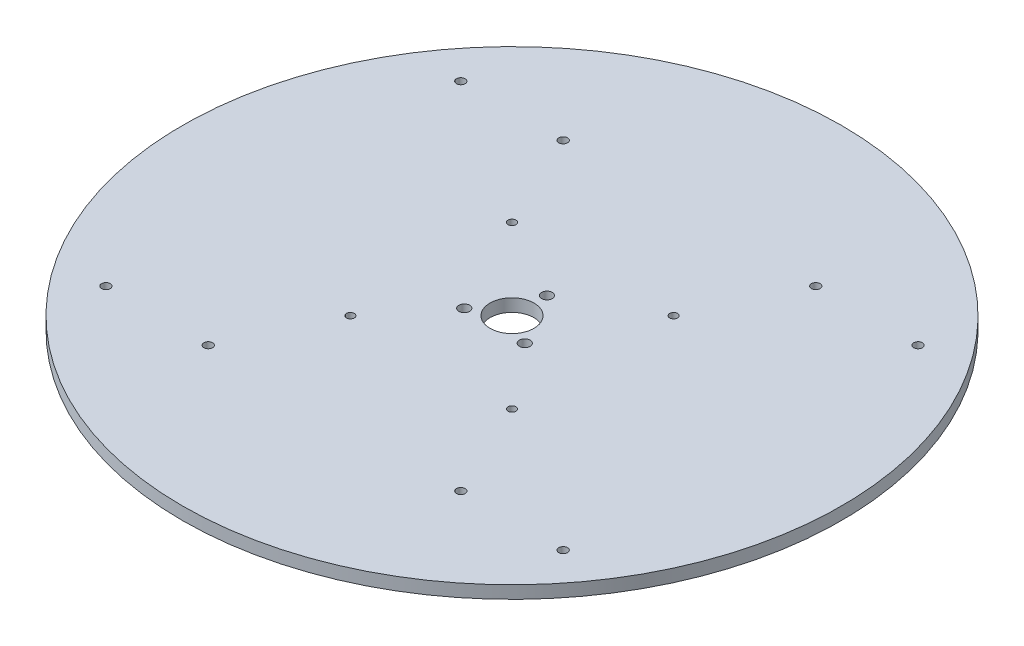
ISO-10303-21;
HEADER;
FILE_DESCRIPTION(('STEP AP214'),'2;1');
FILE_NAME('part.step','',(''),(''),'','','');
FILE_SCHEMA(('AUTOMOTIVE_DESIGN { 1 0 10303 214 1 1 1 1 }'));
ENDSEC;
DATA;
#1=APPLICATION_CONTEXT('core data for automotive mechanical design processes');
#2=APPLICATION_PROTOCOL_DEFINITION('international standard','automotive_design',2000,#1);
#3=PRODUCT_CONTEXT('',#1,'mechanical');
#4=PRODUCT('Part','Part','',(#3));
#5=PRODUCT_RELATED_PRODUCT_CATEGORY('part','',(#4));
#6=PRODUCT_DEFINITION_FORMATION('','',#4);
#7=PRODUCT_DEFINITION_CONTEXT('part definition',#1,'design');
#8=PRODUCT_DEFINITION('design','',#6,#7);
#9=PRODUCT_DEFINITION_SHAPE('','',#8);
#10=(LENGTH_UNIT() NAMED_UNIT(*) SI_UNIT(.MILLI.,.METRE.));
#11=(NAMED_UNIT(*) PLANE_ANGLE_UNIT() SI_UNIT($,.RADIAN.));
#12=(NAMED_UNIT(*) SI_UNIT($,.STERADIAN.) SOLID_ANGLE_UNIT());
#13=UNCERTAINTY_MEASURE_WITH_UNIT(LENGTH_MEASURE(1.E-05),#10,'distance_accuracy_value','');
#14=(GEOMETRIC_REPRESENTATION_CONTEXT(3) GLOBAL_UNCERTAINTY_ASSIGNED_CONTEXT((#13)) GLOBAL_UNIT_ASSIGNED_CONTEXT((#10,
#11,#12)) REPRESENTATION_CONTEXT('',''));
#15=CARTESIAN_POINT('',(0.,0.,0.));
#16=DIRECTION('',(0.,0.,1.));
#17=DIRECTION('',(1.,0.,0.));
#18=AXIS2_PLACEMENT_3D('',#15,#16,#17);
#19=CARTESIAN_POINT('',(0.,6.35,0.));
#20=DIRECTION('',(0.,-1.,0.));
#21=DIRECTION('',(0.,0.,-1.));
#22=AXIS2_PLACEMENT_3D('',#19,#20,#21);
#23=CYLINDRICAL_SURFACE('',#22,165.1);
#24=CARTESIAN_POINT('',(0.,6.35,0.));
#25=DIRECTION('',(0.,1.,0.));
#26=DIRECTION('',(0.,0.,1.));
#27=AXIS2_PLACEMENT_3D('',#24,#25,#26);
#28=CIRCLE('',#27,165.1);
#29=CARTESIAN_POINT('',(0.,6.35,165.1));
#30=VERTEX_POINT('',#29);
#31=EDGE_CURVE('E10',#30,#30,#28,.T.);
#32=ORIENTED_EDGE('',*,*,#31,.F.);
#33=EDGE_LOOP('',(#32));
#34=FACE_BOUND('',#33,.T.);
#35=CARTESIAN_POINT('',(0.,0.,0.));
#36=DIRECTION('',(0.,1.,0.));
#37=DIRECTION('',(0.,0.,1.));
#38=AXIS2_PLACEMENT_3D('',#35,#36,#37);
#39=CIRCLE('',#38,165.1);
#40=CARTESIAN_POINT('',(0.,0.,165.1));
#41=VERTEX_POINT('',#40);
#42=EDGE_CURVE('E34',#41,#41,#39,.T.);
#43=ORIENTED_EDGE('',*,*,#42,.T.);
#44=EDGE_LOOP('',(#43));
#45=FACE_BOUND('',#44,.T.);
#46=ADVANCED_FACE('F31',(#34,#45),#23,.T.);
#47=CARTESIAN_POINT('',(0.,6.35,0.));
#48=DIRECTION('',(0.,1.,0.));
#49=DIRECTION('',(0.,0.,1.));
#50=AXIS2_PLACEMENT_3D('',#47,#48,#49);
#51=PLANE('',#50);
#52=CARTESIAN_POINT('',(-63.2587,6.35,-88.9));
#53=DIRECTION('',(0.,1.,0.));
#54=DIRECTION('',(0.,0.,1.));
#55=AXIS2_PLACEMENT_3D('',#52,#53,#54);
#56=CIRCLE('',#55,2.1828125);
#57=CARTESIAN_POINT('',(-63.2587,6.35,-86.7171875));
#58=VERTEX_POINT('',#57);
#59=EDGE_CURVE('E133',#58,#58,#56,.T.);
#60=ORIENTED_EDGE('',*,*,#59,.F.);
#61=EDGE_LOOP('',(#60));
#62=FACE_BOUND('',#61,.T.);
#63=CARTESIAN_POINT('',(63.2587,6.35,-88.9));
#64=DIRECTION('',(0.,1.,0.));
#65=DIRECTION('',(0.,0.,1.));
#66=AXIS2_PLACEMENT_3D('',#63,#64,#65);
#67=CIRCLE('',#66,2.1828125);
#68=CARTESIAN_POINT('',(63.2587,6.35,-86.7171875));
#69=VERTEX_POINT('',#68);
#70=EDGE_CURVE('E127',#69,#69,#67,.T.);
#71=ORIENTED_EDGE('',*,*,#70,.F.);
#72=EDGE_LOOP('',(#71));
#73=FACE_BOUND('',#72,.T.);
#74=CARTESIAN_POINT('',(114.5413,6.35,-88.9));
#75=DIRECTION('',(0.,1.,0.));
#76=DIRECTION('',(0.,0.,1.));
#77=AXIS2_PLACEMENT_3D('',#74,#75,#76);
#78=CIRCLE('',#77,2.18281250000001);
#79=CARTESIAN_POINT('',(114.5413,6.35,-86.7171875));
#80=VERTEX_POINT('',#79);
#81=EDGE_CURVE('E121',#80,#80,#78,.T.);
#82=ORIENTED_EDGE('',*,*,#81,.F.);
#83=EDGE_LOOP('',(#82));
#84=FACE_BOUND('',#83,.T.);
#85=CARTESIAN_POINT('',(114.5413,6.35,88.8999999999999));
#86=DIRECTION('',(0.,1.,0.));
#87=DIRECTION('',(0.,0.,1.));
#88=AXIS2_PLACEMENT_3D('',#85,#86,#87);
#89=CIRCLE('',#88,2.18281250000001);
#90=CARTESIAN_POINT('',(114.5413,6.35,91.0828125));
#91=VERTEX_POINT('',#90);
#92=EDGE_CURVE('E115',#91,#91,#89,.T.);
#93=ORIENTED_EDGE('',*,*,#92,.F.);
#94=EDGE_LOOP('',(#93));
#95=FACE_BOUND('',#94,.T.);
#96=CARTESIAN_POINT('',(63.2587,6.35,88.9));
#97=DIRECTION('',(0.,1.,0.));
#98=DIRECTION('',(0.,0.,1.));
#99=AXIS2_PLACEMENT_3D('',#96,#97,#98);
#100=CIRCLE('',#99,2.1828125);
#101=CARTESIAN_POINT('',(63.2587,6.35,91.0828125));
#102=VERTEX_POINT('',#101);
#103=EDGE_CURVE('E109',#102,#102,#100,.T.);
#104=ORIENTED_EDGE('',*,*,#103,.F.);
#105=EDGE_LOOP('',(#104));
#106=FACE_BOUND('',#105,.T.);
#107=CARTESIAN_POINT('',(-63.2587,6.35,88.8999999999999));
#108=DIRECTION('',(0.,1.,0.));
#109=DIRECTION('',(0.,0.,1.));
#110=AXIS2_PLACEMENT_3D('',#107,#108,#109);
#111=CIRCLE('',#110,2.1828125);
#112=CARTESIAN_POINT('',(-63.2587,6.35,91.0828125));
#113=VERTEX_POINT('',#112);
#114=EDGE_CURVE('E103',#113,#113,#111,.T.);
#115=ORIENTED_EDGE('',*,*,#114,.F.);
#116=EDGE_LOOP('',(#115));
#117=FACE_BOUND('',#116,.T.);
#118=CARTESIAN_POINT('',(-114.5413,6.35,88.9));
#119=DIRECTION('',(0.,1.,0.));
#120=DIRECTION('',(0.,0.,1.));
#121=AXIS2_PLACEMENT_3D('',#118,#119,#120);
#122=CIRCLE('',#121,2.1828125);
#123=CARTESIAN_POINT('',(-114.5413,6.35,91.0828125));
#124=VERTEX_POINT('',#123);
#125=EDGE_CURVE('E97',#124,#124,#122,.T.);
#126=ORIENTED_EDGE('',*,*,#125,.F.);
#127=EDGE_LOOP('',(#126));
#128=FACE_BOUND('',#127,.T.);
#129=CARTESIAN_POINT('',(-114.5413,6.35,-88.9));
#130=DIRECTION('',(0.,1.,0.));
#131=DIRECTION('',(0.,0.,1.));
#132=AXIS2_PLACEMENT_3D('',#129,#130,#131);
#133=CIRCLE('',#132,2.1828125);
#134=CARTESIAN_POINT('',(-114.5413,6.35,-86.7171875));
#135=VERTEX_POINT('',#134);
#136=EDGE_CURVE('E91',#135,#135,#133,.T.);
#137=ORIENTED_EDGE('',*,*,#136,.F.);
#138=EDGE_LOOP('',(#137));
#139=FACE_BOUND('',#138,.T.);
#140=CARTESIAN_POINT('',(15.1554445662276,6.35,8.75000000000007));
#141=DIRECTION('',(0.,1.,0.));
#142=DIRECTION('',(0.,0.,1.));
#143=AXIS2_PLACEMENT_3D('',#140,#141,#142);
#144=CIRCLE('',#143,2.7);
#145=CARTESIAN_POINT('',(15.1554445662276,6.35,11.4500000000001));
#146=VERTEX_POINT('',#145);
#147=EDGE_CURVE('E67',#146,#146,#144,.T.);
#148=ORIENTED_EDGE('',*,*,#147,.F.);
#149=EDGE_LOOP('',(#148));
#150=FACE_BOUND('',#149,.T.);
#151=CARTESIAN_POINT('',(-15.1554445662276,6.35,8.75000000000007));
#152=DIRECTION('',(0.,1.,0.));
#153=DIRECTION('',(0.,0.,1.));
#154=AXIS2_PLACEMENT_3D('',#151,#152,#153);
#155=CIRCLE('',#154,2.7);
#156=CARTESIAN_POINT('',(-15.1554445662276,6.35,11.4500000000001));
#157=VERTEX_POINT('',#156);
#158=EDGE_CURVE('E74',#157,#157,#155,.T.);
#159=ORIENTED_EDGE('',*,*,#158,.F.);
#160=EDGE_LOOP('',(#159));
#161=FACE_BOUND('',#160,.T.);
#162=CARTESIAN_POINT('',(0.,6.35,-17.5));
#163=DIRECTION('',(0.,1.,0.));
#164=DIRECTION('',(0.,0.,1.));
#165=AXIS2_PLACEMENT_3D('',#162,#163,#164);
#166=CIRCLE('',#165,2.7);
#167=CARTESIAN_POINT('',(0.,6.35,-14.8));
#168=VERTEX_POINT('',#167);
#169=EDGE_CURVE('E80',#168,#168,#166,.T.);
#170=ORIENTED_EDGE('',*,*,#169,.F.);
#171=EDGE_LOOP('',(#170));
#172=FACE_BOUND('',#171,.T.);
#173=CARTESIAN_POINT('',(40.4876,6.35,-40.4876));
#174=DIRECTION('',(0.,1.,0.));
#175=DIRECTION('',(0.,0.,1.));
#176=AXIS2_PLACEMENT_3D('',#173,#174,#175);
#177=CIRCLE('',#176,1.98437499999999);
#178=CARTESIAN_POINT('',(40.4876,6.35,-38.503225));
#179=VERTEX_POINT('',#178);
#180=EDGE_CURVE('E86',#179,#179,#177,.T.);
#181=ORIENTED_EDGE('',*,*,#180,.F.);
#182=EDGE_LOOP('',(#181));
#183=FACE_BOUND('',#182,.T.);
#184=CARTESIAN_POINT('',(40.4876,6.35,40.4876));
#185=DIRECTION('',(0.,1.,0.));
#186=DIRECTION('',(0.,0.,1.));
#187=AXIS2_PLACEMENT_3D('',#184,#185,#186);
#188=CIRCLE('',#187,1.98437499999999);
#189=CARTESIAN_POINT('',(40.4876,6.35,42.471975));
#190=VERTEX_POINT('',#189);
#191=EDGE_CURVE('E49',#190,#190,#188,.T.);
#192=ORIENTED_EDGE('',*,*,#191,.F.);
#193=EDGE_LOOP('',(#192));
#194=FACE_BOUND('',#193,.T.);
#195=CARTESIAN_POINT('',(-40.4876,6.35,40.4876));
#196=DIRECTION('',(0.,1.,0.));
#197=DIRECTION('',(0.,0.,1.));
#198=AXIS2_PLACEMENT_3D('',#195,#196,#197);
#199=CIRCLE('',#198,1.98437499999999);
#200=CARTESIAN_POINT('',(-40.4876,6.35,42.471975));
#201=VERTEX_POINT('',#200);
#202=EDGE_CURVE('E56',#201,#201,#199,.T.);
#203=ORIENTED_EDGE('',*,*,#202,.F.);
#204=EDGE_LOOP('',(#203));
#205=FACE_BOUND('',#204,.T.);
#206=CARTESIAN_POINT('',(-40.4876,6.35,-40.4876));
#207=DIRECTION('',(0.,1.,0.));
#208=DIRECTION('',(0.,0.,1.));
#209=AXIS2_PLACEMENT_3D('',#206,#207,#208);
#210=CIRCLE('',#209,1.98437499999999);
#211=CARTESIAN_POINT('',(-40.4876,6.35,-38.503225));
#212=VERTEX_POINT('',#211);
#213=EDGE_CURVE('E62',#212,#212,#210,.T.);
#214=ORIENTED_EDGE('',*,*,#213,.F.);
#215=EDGE_LOOP('',(#214));
#216=FACE_BOUND('',#215,.T.);
#217=CARTESIAN_POINT('',(0.,6.35,0.));
#218=DIRECTION('',(0.,1.,0.));
#219=DIRECTION('',(0.,0.,1.));
#220=AXIS2_PLACEMENT_3D('',#217,#218,#219);
#221=CIRCLE('',#220,11.);
#222=CARTESIAN_POINT('',(0.,6.35,11.));
#223=VERTEX_POINT('',#222);
#224=EDGE_CURVE('E43',#223,#223,#221,.T.);
#225=ORIENTED_EDGE('',*,*,#224,.F.);
#226=EDGE_LOOP('',(#225));
#227=FACE_BOUND('',#226,.T.);
#228=ORIENTED_EDGE('',*,*,#31,.T.);
#229=EDGE_LOOP('',(#228));
#230=FACE_BOUND('',#229,.T.);
#231=ADVANCED_FACE('F149',(#62,#73,#84,#95,#106,#117,#128,#139,#150,#161,#172,#183,#194,#205,
#216,#227,#230),#51,.T.);
#232=CARTESIAN_POINT('',(0.,0.,0.));
#233=DIRECTION('',(0.,1.,0.));
#234=DIRECTION('',(0.,0.,1.));
#235=AXIS2_PLACEMENT_3D('',#232,#233,#234);
#236=PLANE('',#235);
#237=CARTESIAN_POINT('',(-63.2587,0.,-88.9));
#238=DIRECTION('',(0.,1.,0.));
#239=DIRECTION('',(0.,0.,1.));
#240=AXIS2_PLACEMENT_3D('',#237,#238,#239);
#241=CIRCLE('',#240,2.1828125);
#242=CARTESIAN_POINT('',(-63.2587,0.,-86.7171875));
#243=VERTEX_POINT('',#242);
#244=EDGE_CURVE('E94',#243,#243,#241,.T.);
#245=ORIENTED_EDGE('',*,*,#244,.T.);
#246=EDGE_LOOP('',(#245));
#247=FACE_BOUND('',#246,.T.);
#248=CARTESIAN_POINT('',(63.2587,0.,-88.9));
#249=DIRECTION('',(0.,1.,0.));
#250=DIRECTION('',(0.,0.,1.));
#251=AXIS2_PLACEMENT_3D('',#248,#249,#250);
#252=CIRCLE('',#251,2.1828125);
#253=CARTESIAN_POINT('',(63.2587,0.,-86.7171875));
#254=VERTEX_POINT('',#253);
#255=EDGE_CURVE('E130',#254,#254,#252,.T.);
#256=ORIENTED_EDGE('',*,*,#255,.T.);
#257=EDGE_LOOP('',(#256));
#258=FACE_BOUND('',#257,.T.);
#259=CARTESIAN_POINT('',(114.5413,0.,-88.9));
#260=DIRECTION('',(0.,1.,0.));
#261=DIRECTION('',(0.,0.,1.));
#262=AXIS2_PLACEMENT_3D('',#259,#260,#261);
#263=CIRCLE('',#262,2.18281250000001);
#264=CARTESIAN_POINT('',(114.5413,0.,-86.7171875));
#265=VERTEX_POINT('',#264);
#266=EDGE_CURVE('E124',#265,#265,#263,.T.);
#267=ORIENTED_EDGE('',*,*,#266,.T.);
#268=EDGE_LOOP('',(#267));
#269=FACE_BOUND('',#268,.T.);
#270=CARTESIAN_POINT('',(114.5413,0.,88.8999999999999));
#271=DIRECTION('',(0.,1.,0.));
#272=DIRECTION('',(0.,0.,1.));
#273=AXIS2_PLACEMENT_3D('',#270,#271,#272);
#274=CIRCLE('',#273,2.18281250000001);
#275=CARTESIAN_POINT('',(114.5413,0.,91.0828125));
#276=VERTEX_POINT('',#275);
#277=EDGE_CURVE('E118',#276,#276,#274,.T.);
#278=ORIENTED_EDGE('',*,*,#277,.T.);
#279=EDGE_LOOP('',(#278));
#280=FACE_BOUND('',#279,.T.);
#281=CARTESIAN_POINT('',(63.2587,0.,88.9));
#282=DIRECTION('',(0.,1.,0.));
#283=DIRECTION('',(0.,0.,1.));
#284=AXIS2_PLACEMENT_3D('',#281,#282,#283);
#285=CIRCLE('',#284,2.1828125);
#286=CARTESIAN_POINT('',(63.2587,0.,91.0828125));
#287=VERTEX_POINT('',#286);
#288=EDGE_CURVE('E112',#287,#287,#285,.T.);
#289=ORIENTED_EDGE('',*,*,#288,.T.);
#290=EDGE_LOOP('',(#289));
#291=FACE_BOUND('',#290,.T.);
#292=CARTESIAN_POINT('',(-63.2587,0.,88.8999999999999));
#293=DIRECTION('',(0.,1.,0.));
#294=DIRECTION('',(0.,0.,1.));
#295=AXIS2_PLACEMENT_3D('',#292,#293,#294);
#296=CIRCLE('',#295,2.1828125);
#297=CARTESIAN_POINT('',(-63.2587,0.,91.0828125));
#298=VERTEX_POINT('',#297);
#299=EDGE_CURVE('E106',#298,#298,#296,.T.);
#300=ORIENTED_EDGE('',*,*,#299,.T.);
#301=EDGE_LOOP('',(#300));
#302=FACE_BOUND('',#301,.T.);
#303=CARTESIAN_POINT('',(-114.5413,0.,88.9));
#304=DIRECTION('',(0.,1.,0.));
#305=DIRECTION('',(0.,0.,1.));
#306=AXIS2_PLACEMENT_3D('',#303,#304,#305);
#307=CIRCLE('',#306,2.1828125);
#308=CARTESIAN_POINT('',(-114.5413,0.,91.0828125));
#309=VERTEX_POINT('',#308);
#310=EDGE_CURVE('E100',#309,#309,#307,.T.);
#311=ORIENTED_EDGE('',*,*,#310,.T.);
#312=EDGE_LOOP('',(#311));
#313=FACE_BOUND('',#312,.T.);
#314=CARTESIAN_POINT('',(-114.5413,0.,-88.9));
#315=DIRECTION('',(0.,1.,0.));
#316=DIRECTION('',(0.,0.,1.));
#317=AXIS2_PLACEMENT_3D('',#314,#315,#316);
#318=CIRCLE('',#317,2.1828125);
#319=CARTESIAN_POINT('',(-114.5413,0.,-86.7171875));
#320=VERTEX_POINT('',#319);
#321=EDGE_CURVE('E71',#320,#320,#318,.T.);
#322=ORIENTED_EDGE('',*,*,#321,.T.);
#323=EDGE_LOOP('',(#322));
#324=FACE_BOUND('',#323,.T.);
#325=CARTESIAN_POINT('',(15.1554445662276,0.,8.75000000000007));
#326=DIRECTION('',(0.,1.,0.));
#327=DIRECTION('',(0.,0.,1.));
#328=AXIS2_PLACEMENT_3D('',#325,#326,#327);
#329=CIRCLE('',#328,2.7);
#330=CARTESIAN_POINT('',(15.1554445662276,0.,11.4500000000001));
#331=VERTEX_POINT('',#330);
#332=EDGE_CURVE('E70',#331,#331,#329,.T.);
#333=ORIENTED_EDGE('',*,*,#332,.T.);
#334=EDGE_LOOP('',(#333));
#335=FACE_BOUND('',#334,.T.);
#336=CARTESIAN_POINT('',(-15.1554445662276,0.,8.75000000000007));
#337=DIRECTION('',(0.,1.,0.));
#338=DIRECTION('',(0.,0.,1.));
#339=AXIS2_PLACEMENT_3D('',#336,#337,#338);
#340=CIRCLE('',#339,2.7);
#341=CARTESIAN_POINT('',(-15.1554445662276,0.,11.4500000000001));
#342=VERTEX_POINT('',#341);
#343=EDGE_CURVE('E77',#342,#342,#340,.T.);
#344=ORIENTED_EDGE('',*,*,#343,.T.);
#345=EDGE_LOOP('',(#344));
#346=FACE_BOUND('',#345,.T.);
#347=CARTESIAN_POINT('',(0.,0.,-17.5));
#348=DIRECTION('',(0.,1.,0.));
#349=DIRECTION('',(0.,0.,1.));
#350=AXIS2_PLACEMENT_3D('',#347,#348,#349);
#351=CIRCLE('',#350,2.7);
#352=CARTESIAN_POINT('',(0.,0.,-14.8));
#353=VERTEX_POINT('',#352);
#354=EDGE_CURVE('E83',#353,#353,#351,.T.);
#355=ORIENTED_EDGE('',*,*,#354,.T.);
#356=EDGE_LOOP('',(#355));
#357=FACE_BOUND('',#356,.T.);
#358=CARTESIAN_POINT('',(40.4876,0.,-40.4876));
#359=DIRECTION('',(0.,1.,0.));
#360=DIRECTION('',(0.,0.,1.));
#361=AXIS2_PLACEMENT_3D('',#358,#359,#360);
#362=CIRCLE('',#361,1.98437499999999);
#363=CARTESIAN_POINT('',(40.4876,0.,-38.503225));
#364=VERTEX_POINT('',#363);
#365=EDGE_CURVE('E53',#364,#364,#362,.T.);
#366=ORIENTED_EDGE('',*,*,#365,.T.);
#367=EDGE_LOOP('',(#366));
#368=FACE_BOUND('',#367,.T.);
#369=CARTESIAN_POINT('',(40.4876,0.,40.4876));
#370=DIRECTION('',(0.,1.,0.));
#371=DIRECTION('',(0.,0.,1.));
#372=AXIS2_PLACEMENT_3D('',#369,#370,#371);
#373=CIRCLE('',#372,1.98437499999999);
#374=CARTESIAN_POINT('',(40.4876,0.,42.471975));
#375=VERTEX_POINT('',#374);
#376=EDGE_CURVE('E52',#375,#375,#373,.T.);
#377=ORIENTED_EDGE('',*,*,#376,.T.);
#378=EDGE_LOOP('',(#377));
#379=FACE_BOUND('',#378,.T.);
#380=CARTESIAN_POINT('',(-40.4876,0.,40.4876));
#381=DIRECTION('',(0.,1.,0.));
#382=DIRECTION('',(0.,0.,1.));
#383=AXIS2_PLACEMENT_3D('',#380,#381,#382);
#384=CIRCLE('',#383,1.98437499999999);
#385=CARTESIAN_POINT('',(-40.4876,0.,42.471975));
#386=VERTEX_POINT('',#385);
#387=EDGE_CURVE('E59',#386,#386,#384,.T.);
#388=ORIENTED_EDGE('',*,*,#387,.T.);
#389=EDGE_LOOP('',(#388));
#390=FACE_BOUND('',#389,.T.);
#391=CARTESIAN_POINT('',(-40.4876,0.,-40.4876));
#392=DIRECTION('',(0.,1.,0.));
#393=DIRECTION('',(0.,0.,1.));
#394=AXIS2_PLACEMENT_3D('',#391,#392,#393);
#395=CIRCLE('',#394,1.98437499999999);
#396=CARTESIAN_POINT('',(-40.4876,0.,-38.503225));
#397=VERTEX_POINT('',#396);
#398=EDGE_CURVE('E46',#397,#397,#395,.T.);
#399=ORIENTED_EDGE('',*,*,#398,.T.);
#400=EDGE_LOOP('',(#399));
#401=FACE_BOUND('',#400,.T.);
#402=CARTESIAN_POINT('',(0.,0.,0.));
#403=DIRECTION('',(0.,1.,0.));
#404=DIRECTION('',(0.,0.,1.));
#405=AXIS2_PLACEMENT_3D('',#402,#403,#404);
#406=CIRCLE('',#405,11.);
#407=CARTESIAN_POINT('',(0.,0.,11.));
#408=VERTEX_POINT('',#407);
#409=EDGE_CURVE('E41',#408,#408,#406,.T.);
#410=ORIENTED_EDGE('',*,*,#409,.T.);
#411=EDGE_LOOP('',(#410));
#412=FACE_BOUND('',#411,.T.);
#413=ORIENTED_EDGE('',*,*,#42,.F.);
#414=EDGE_LOOP('',(#413));
#415=FACE_BOUND('',#414,.T.);
#416=ADVANCED_FACE('F139',(#247,#258,#269,#280,#291,#302,#313,#324,#335,#346,#357,#368,#379,
#390,#401,#412,#415),#236,.F.);
#417=CARTESIAN_POINT('',(0.,0.,0.));
#418=DIRECTION('',(0.,1.,0.));
#419=DIRECTION('',(0.,0.,1.));
#420=AXIS2_PLACEMENT_3D('',#417,#418,#419);
#421=CYLINDRICAL_SURFACE('',#420,11.);
#422=ORIENTED_EDGE('',*,*,#409,.F.);
#423=EDGE_LOOP('',(#422));
#424=FACE_BOUND('',#423,.T.);
#425=ORIENTED_EDGE('',*,*,#224,.T.);
#426=EDGE_LOOP('',(#425));
#427=FACE_BOUND('',#426,.T.);
#428=ADVANCED_FACE('F183',(#424,#427),#421,.F.);
#429=CARTESIAN_POINT('',(-40.4876,0.,-40.4876));
#430=DIRECTION('',(0.,1.,0.));
#431=DIRECTION('',(0.,0.,1.));
#432=AXIS2_PLACEMENT_3D('',#429,#430,#431);
#433=CYLINDRICAL_SURFACE('',#432,1.98437499999999);
#434=ORIENTED_EDGE('',*,*,#398,.F.);
#435=EDGE_LOOP('',(#434));
#436=FACE_BOUND('',#435,.T.);
#437=ORIENTED_EDGE('',*,*,#213,.T.);
#438=EDGE_LOOP('',(#437));
#439=FACE_BOUND('',#438,.T.);
#440=ADVANCED_FACE('F185',(#436,#439),#433,.F.);
#441=CARTESIAN_POINT('',(-40.4876,0.,40.4876));
#442=DIRECTION('',(0.,1.,0.));
#443=DIRECTION('',(0.,0.,1.));
#444=AXIS2_PLACEMENT_3D('',#441,#442,#443);
#445=CYLINDRICAL_SURFACE('',#444,1.98437499999999);
#446=ORIENTED_EDGE('',*,*,#387,.F.);
#447=EDGE_LOOP('',(#446));
#448=FACE_BOUND('',#447,.T.);
#449=ORIENTED_EDGE('',*,*,#202,.T.);
#450=EDGE_LOOP('',(#449));
#451=FACE_BOUND('',#450,.T.);
#452=ADVANCED_FACE('F192',(#448,#451),#445,.F.);
#453=CARTESIAN_POINT('',(40.4876,0.,40.4876));
#454=DIRECTION('',(0.,1.,0.));
#455=DIRECTION('',(0.,0.,1.));
#456=AXIS2_PLACEMENT_3D('',#453,#454,#455);
#457=CYLINDRICAL_SURFACE('',#456,1.98437499999999);
#458=ORIENTED_EDGE('',*,*,#376,.F.);
#459=EDGE_LOOP('',(#458));
#460=FACE_BOUND('',#459,.T.);
#461=ORIENTED_EDGE('',*,*,#191,.T.);
#462=EDGE_LOOP('',(#461));
#463=FACE_BOUND('',#462,.T.);
#464=ADVANCED_FACE('F303',(#460,#463),#457,.F.);
#465=CARTESIAN_POINT('',(40.4876,0.,-40.4876));
#466=DIRECTION('',(0.,1.,0.));
#467=DIRECTION('',(0.,0.,1.));
#468=AXIS2_PLACEMENT_3D('',#465,#466,#467);
#469=CYLINDRICAL_SURFACE('',#468,1.98437499999999);
#470=ORIENTED_EDGE('',*,*,#365,.F.);
#471=EDGE_LOOP('',(#470));
#472=FACE_BOUND('',#471,.T.);
#473=ORIENTED_EDGE('',*,*,#180,.T.);
#474=EDGE_LOOP('',(#473));
#475=FACE_BOUND('',#474,.T.);
#476=ADVANCED_FACE('F299',(#472,#475),#469,.F.);
#477=CARTESIAN_POINT('',(0.,0.,-17.5));
#478=DIRECTION('',(0.,1.,0.));
#479=DIRECTION('',(0.,0.,1.));
#480=AXIS2_PLACEMENT_3D('',#477,#478,#479);
#481=CYLINDRICAL_SURFACE('',#480,2.7);
#482=ORIENTED_EDGE('',*,*,#354,.F.);
#483=EDGE_LOOP('',(#482));
#484=FACE_BOUND('',#483,.T.);
#485=ORIENTED_EDGE('',*,*,#169,.T.);
#486=EDGE_LOOP('',(#485));
#487=FACE_BOUND('',#486,.T.);
#488=ADVANCED_FACE('F302',(#484,#487),#481,.F.);
#489=CARTESIAN_POINT('',(-15.1554445662276,0.,8.75000000000007));
#490=DIRECTION('',(0.,1.,0.));
#491=DIRECTION('',(0.,0.,1.));
#492=AXIS2_PLACEMENT_3D('',#489,#490,#491);
#493=CYLINDRICAL_SURFACE('',#492,2.7);
#494=ORIENTED_EDGE('',*,*,#343,.F.);
#495=EDGE_LOOP('',(#494));
#496=FACE_BOUND('',#495,.T.);
#497=ORIENTED_EDGE('',*,*,#158,.T.);
#498=EDGE_LOOP('',(#497));
#499=FACE_BOUND('',#498,.T.);
#500=ADVANCED_FACE('F307',(#496,#499),#493,.F.);
#501=CARTESIAN_POINT('',(15.1554445662276,0.,8.75000000000007));
#502=DIRECTION('',(0.,1.,0.));
#503=DIRECTION('',(0.,0.,1.));
#504=AXIS2_PLACEMENT_3D('',#501,#502,#503);
#505=CYLINDRICAL_SURFACE('',#504,2.7);
#506=ORIENTED_EDGE('',*,*,#332,.F.);
#507=EDGE_LOOP('',(#506));
#508=FACE_BOUND('',#507,.T.);
#509=ORIENTED_EDGE('',*,*,#147,.T.);
#510=EDGE_LOOP('',(#509));
#511=FACE_BOUND('',#510,.T.);
#512=ADVANCED_FACE('F225',(#508,#511),#505,.F.);
#513=CARTESIAN_POINT('',(-114.5413,0.,-88.9));
#514=DIRECTION('',(0.,1.,0.));
#515=DIRECTION('',(0.,0.,1.));
#516=AXIS2_PLACEMENT_3D('',#513,#514,#515);
#517=CYLINDRICAL_SURFACE('',#516,2.1828125);
#518=ORIENTED_EDGE('',*,*,#321,.F.);
#519=EDGE_LOOP('',(#518));
#520=FACE_BOUND('',#519,.T.);
#521=ORIENTED_EDGE('',*,*,#136,.T.);
#522=EDGE_LOOP('',(#521));
#523=FACE_BOUND('',#522,.T.);
#524=ADVANCED_FACE('F219',(#520,#523),#517,.F.);
#525=CARTESIAN_POINT('',(-114.5413,0.,88.9));
#526=DIRECTION('',(0.,1.,0.));
#527=DIRECTION('',(0.,0.,1.));
#528=AXIS2_PLACEMENT_3D('',#525,#526,#527);
#529=CYLINDRICAL_SURFACE('',#528,2.1828125);
#530=ORIENTED_EDGE('',*,*,#310,.F.);
#531=EDGE_LOOP('',(#530));
#532=FACE_BOUND('',#531,.T.);
#533=ORIENTED_EDGE('',*,*,#125,.T.);
#534=EDGE_LOOP('',(#533));
#535=FACE_BOUND('',#534,.T.);
#536=ADVANCED_FACE('F224',(#532,#535),#529,.F.);
#537=CARTESIAN_POINT('',(-63.2587,0.,88.8999999999999));
#538=DIRECTION('',(0.,1.,0.));
#539=DIRECTION('',(0.,0.,1.));
#540=AXIS2_PLACEMENT_3D('',#537,#538,#539);
#541=CYLINDRICAL_SURFACE('',#540,2.1828125);
#542=ORIENTED_EDGE('',*,*,#299,.F.);
#543=EDGE_LOOP('',(#542));
#544=FACE_BOUND('',#543,.T.);
#545=ORIENTED_EDGE('',*,*,#114,.T.);
#546=EDGE_LOOP('',(#545));
#547=FACE_BOUND('',#546,.T.);
#548=ADVANCED_FACE('F237',(#544,#547),#541,.F.);
#549=CARTESIAN_POINT('',(63.2587,0.,88.9));
#550=DIRECTION('',(0.,1.,0.));
#551=DIRECTION('',(0.,0.,1.));
#552=AXIS2_PLACEMENT_3D('',#549,#550,#551);
#553=CYLINDRICAL_SURFACE('',#552,2.1828125);
#554=ORIENTED_EDGE('',*,*,#288,.F.);
#555=EDGE_LOOP('',(#554));
#556=FACE_BOUND('',#555,.T.);
#557=ORIENTED_EDGE('',*,*,#103,.T.);
#558=EDGE_LOOP('',(#557));
#559=FACE_BOUND('',#558,.T.);
#560=ADVANCED_FACE('F247',(#556,#559),#553,.F.);
#561=CARTESIAN_POINT('',(114.5413,0.,88.8999999999999));
#562=DIRECTION('',(0.,1.,0.));
#563=DIRECTION('',(0.,0.,1.));
#564=AXIS2_PLACEMENT_3D('',#561,#562,#563);
#565=CYLINDRICAL_SURFACE('',#564,2.18281250000001);
#566=ORIENTED_EDGE('',*,*,#277,.F.);
#567=EDGE_LOOP('',(#566));
#568=FACE_BOUND('',#567,.T.);
#569=ORIENTED_EDGE('',*,*,#92,.T.);
#570=EDGE_LOOP('',(#569));
#571=FACE_BOUND('',#570,.T.);
#572=ADVANCED_FACE('F257',(#568,#571),#565,.F.);
#573=CARTESIAN_POINT('',(114.5413,0.,-88.9));
#574=DIRECTION('',(0.,1.,0.));
#575=DIRECTION('',(0.,0.,1.));
#576=AXIS2_PLACEMENT_3D('',#573,#574,#575);
#577=CYLINDRICAL_SURFACE('',#576,2.18281250000001);
#578=ORIENTED_EDGE('',*,*,#266,.F.);
#579=EDGE_LOOP('',(#578));
#580=FACE_BOUND('',#579,.T.);
#581=ORIENTED_EDGE('',*,*,#81,.T.);
#582=EDGE_LOOP('',(#581));
#583=FACE_BOUND('',#582,.T.);
#584=ADVANCED_FACE('F267',(#580,#583),#577,.F.);
#585=CARTESIAN_POINT('',(63.2587,0.,-88.9));
#586=DIRECTION('',(0.,1.,0.));
#587=DIRECTION('',(0.,0.,1.));
#588=AXIS2_PLACEMENT_3D('',#585,#586,#587);
#589=CYLINDRICAL_SURFACE('',#588,2.1828125);
#590=ORIENTED_EDGE('',*,*,#255,.F.);
#591=EDGE_LOOP('',(#590));
#592=FACE_BOUND('',#591,.T.);
#593=ORIENTED_EDGE('',*,*,#70,.T.);
#594=EDGE_LOOP('',(#593));
#595=FACE_BOUND('',#594,.T.);
#596=ADVANCED_FACE('F145',(#592,#595),#589,.F.);
#597=CARTESIAN_POINT('',(-63.2587,0.,-88.9));
#598=DIRECTION('',(0.,1.,0.));
#599=DIRECTION('',(0.,0.,1.));
#600=AXIS2_PLACEMENT_3D('',#597,#598,#599);
#601=CYLINDRICAL_SURFACE('',#600,2.1828125);
#602=ORIENTED_EDGE('',*,*,#244,.F.);
#603=EDGE_LOOP('',(#602));
#604=FACE_BOUND('',#603,.T.);
#605=ORIENTED_EDGE('',*,*,#59,.T.);
#606=EDGE_LOOP('',(#605));
#607=FACE_BOUND('',#606,.T.);
#608=ADVANCED_FACE('F142',(#604,#607),#601,.F.);
#609=CLOSED_SHELL('',(#46,#231,#416,#428,#440,#452,#464,#476,#488,#500,#512,#524,#536,#548,#560,
#572,#584,#596,#608));
#610=MANIFOLD_SOLID_BREP('B2',#609);
#611=ADVANCED_BREP_SHAPE_REPRESENTATION('',(#18,#610),#14);
#612=SHAPE_DEFINITION_REPRESENTATION(#9,#611);
ENDSEC;
END-ISO-10303-21;
